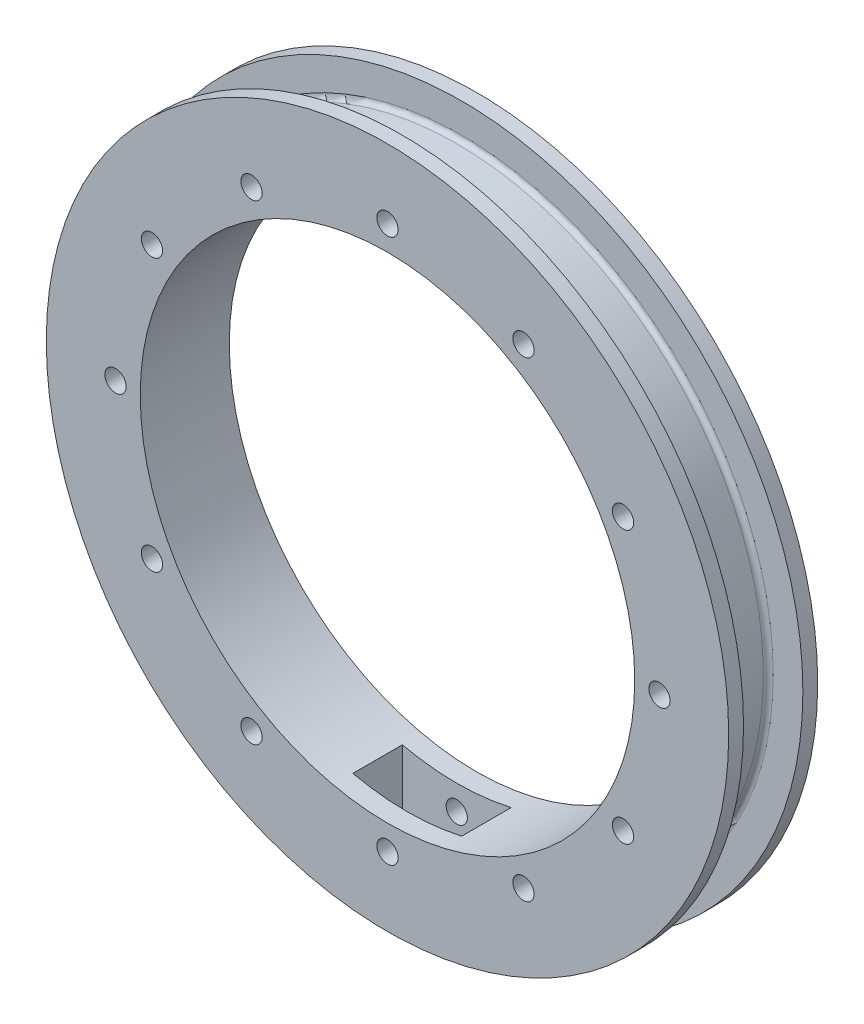
ISO-10303-21;
HEADER;
FILE_DESCRIPTION(('STEP AP214'),'2;1');
FILE_NAME('part.step','',(''),(''),'','','');
FILE_SCHEMA(('AUTOMOTIVE_DESIGN { 1 0 10303 214 1 1 1 1 }'));
ENDSEC;
DATA;
#1=APPLICATION_CONTEXT('core data for automotive mechanical design processes');
#2=APPLICATION_PROTOCOL_DEFINITION('international standard','automotive_design',2000,#1);
#3=PRODUCT_CONTEXT('',#1,'mechanical');
#4=PRODUCT('Part','Part','',(#3));
#5=PRODUCT_RELATED_PRODUCT_CATEGORY('part','',(#4));
#6=PRODUCT_DEFINITION_FORMATION('','',#4);
#7=PRODUCT_DEFINITION_CONTEXT('part definition',#1,'design');
#8=PRODUCT_DEFINITION('design','',#6,#7);
#9=PRODUCT_DEFINITION_SHAPE('','',#8);
#10=(LENGTH_UNIT() NAMED_UNIT(*) SI_UNIT(.MILLI.,.METRE.));
#11=(NAMED_UNIT(*) PLANE_ANGLE_UNIT() SI_UNIT($,.RADIAN.));
#12=(NAMED_UNIT(*) SI_UNIT($,.STERADIAN.) SOLID_ANGLE_UNIT());
#13=UNCERTAINTY_MEASURE_WITH_UNIT(LENGTH_MEASURE(1.E-05),#10,'distance_accuracy_value','');
#14=(GEOMETRIC_REPRESENTATION_CONTEXT(3) GLOBAL_UNCERTAINTY_ASSIGNED_CONTEXT((#13)) GLOBAL_UNIT_ASSIGNED_CONTEXT((#10,
#11,#12)) REPRESENTATION_CONTEXT('',''));
#15=CARTESIAN_POINT('',(0.,0.,0.));
#16=DIRECTION('',(0.,0.,1.));
#17=DIRECTION('',(1.,0.,0.));
#18=AXIS2_PLACEMENT_3D('',#15,#16,#17);
#19=CARTESIAN_POINT('',(0.,0.,-6.));
#20=DIRECTION('',(0.,0.,-1.));
#21=DIRECTION('',(-1.,0.,0.));
#22=AXIS2_PLACEMENT_3D('',#19,#20,#21);
#23=PLANE('',#22);
#24=CARTESIAN_POINT('',(0.,0.,-6.));
#25=DIRECTION('',(0.,0.,1.));
#26=DIRECTION('',(1.,0.,0.));
#27=AXIS2_PLACEMENT_3D('',#24,#25,#26);
#28=CIRCLE('',#27,69.);
#29=CARTESIAN_POINT('',(69.,0.,-6.));
#30=VERTEX_POINT('',#29);
#31=EDGE_CURVE('E129',#30,#30,#28,.F.);
#32=ORIENTED_EDGE('',*,*,#31,.F.);
#33=EDGE_LOOP('',(#32));
#34=FACE_BOUND('',#33,.T.);
#35=CARTESIAN_POINT('',(0.,0.,-6.));
#36=DIRECTION('',(0.,0.,1.));
#37=DIRECTION('',(-1.,0.,0.));
#38=AXIS2_PLACEMENT_3D('',#35,#36,#37);
#39=CIRCLE('',#38,63.);
#40=CARTESIAN_POINT('',(63.,0.,-6.));
#41=VERTEX_POINT('',#40);
#42=CARTESIAN_POINT('',(-63.,0.,-6.));
#43=VERTEX_POINT('',#42);
#44=EDGE_CURVE('E82',#41,#43,#39,.F.);
#45=ORIENTED_EDGE('',*,*,#44,.T.);
#46=CARTESIAN_POINT('',(0.,0.,-6.));
#47=DIRECTION('',(0.,0.,1.));
#48=DIRECTION('',(1.,0.,0.));
#49=AXIS2_PLACEMENT_3D('',#46,#47,#48);
#50=CIRCLE('',#49,63.);
#51=EDGE_CURVE('E79',#41,#43,#50,.T.);
#52=ORIENTED_EDGE('',*,*,#51,.F.);
#53=EDGE_LOOP('',(#45,#52));
#54=FACE_BOUND('',#53,.T.);
#55=ADVANCED_FACE('F17',(#34,#54),#23,.F.);
#56=CARTESIAN_POINT('',(0.,0.,-5.));
#57=DIRECTION('',(0.,0.,-1.));
#58=DIRECTION('',(-1.,0.,0.));
#59=AXIS2_PLACEMENT_3D('',#56,#57,#58);
#60=TOROIDAL_SURFACE('',#59,63.,1.);
#61=ORIENTED_EDGE('',*,*,#51,.T.);
#62=ORIENTED_EDGE('',*,*,#44,.F.);
#63=EDGE_LOOP('',(#61,#62));
#64=FACE_BOUND('',#63,.T.);
#65=CARTESIAN_POINT('',(0.,0.,-5.));
#66=DIRECTION('',(0.,0.,-1.));
#67=DIRECTION('',(-1.,0.,0.));
#68=AXIS2_PLACEMENT_3D('',#65,#66,#67);
#69=CIRCLE('',#68,62.);
#70=CARTESIAN_POINT('',(11.,-61.0163912403872,-5.));
#71=VERTEX_POINT('',#70);
#72=CARTESIAN_POINT('',(-11.,-61.0163912403872,-5.));
#73=VERTEX_POINT('',#72);
#74=EDGE_CURVE('E134',#71,#73,#69,.T.);
#75=ORIENTED_EDGE('',*,*,#74,.T.);
#76=CARTESIAN_POINT('',(0.,0.,-5.));
#77=DIRECTION('',(0.,0.,-1.));
#78=DIRECTION('',(-1.,0.,0.));
#79=AXIS2_PLACEMENT_3D('',#76,#77,#78);
#80=CIRCLE('',#79,62.);
#81=EDGE_CURVE('E61',#71,#73,#80,.F.);
#82=ORIENTED_EDGE('',*,*,#81,.F.);
#83=EDGE_LOOP('',(#75,#82));
#84=FACE_BOUND('',#83,.T.);
#85=ADVANCED_FACE('F81',(#64,#84),#60,.F.);
#86=CARTESIAN_POINT('',(0.,0.,6.));
#87=DIRECTION('',(0.,0.,-1.));
#88=DIRECTION('',(-1.,0.,0.));
#89=AXIS2_PLACEMENT_3D('',#86,#87,#88);
#90=CYLINDRICAL_SURFACE('',#89,62.);
#91=DIRECTION('',(0.,0.,-1.));
#92=VECTOR('',#91,1.);
#93=CARTESIAN_POINT('',(11.,-61.0163912403872,5.));
#94=LINE('',#93,#92);
#95=CARTESIAN_POINT('',(11.,-61.0163912403872,5.));
#96=VERTEX_POINT('',#95);
#97=EDGE_CURVE('E170',#96,#71,#94,.T.);
#98=ORIENTED_EDGE('',*,*,#97,.T.);
#99=ORIENTED_EDGE('',*,*,#81,.T.);
#100=DIRECTION('',(0.,0.,1.));
#101=VECTOR('',#100,1.);
#102=CARTESIAN_POINT('',(-11.,-61.0163912403872,5.));
#103=LINE('',#102,#101);
#104=CARTESIAN_POINT('',(-11.,-61.0163912403872,5.));
#105=VERTEX_POINT('',#104);
#106=EDGE_CURVE('E125',#73,#105,#103,.T.);
#107=ORIENTED_EDGE('',*,*,#106,.T.);
#108=CARTESIAN_POINT('',(0.,0.,5.));
#109=DIRECTION('',(0.,0.,1.));
#110=DIRECTION('',(1.,0.,0.));
#111=AXIS2_PLACEMENT_3D('',#108,#109,#110);
#112=CIRCLE('',#111,62.);
#113=EDGE_CURVE('E127',#105,#96,#112,.F.);
#114=ORIENTED_EDGE('',*,*,#113,.T.);
#115=EDGE_LOOP('',(#98,#99,#107,#114));
#116=FACE_BOUND('',#115,.T.);
#117=ADVANCED_FACE('F120',(#116),#90,.T.);
#118=CARTESIAN_POINT('',(-4.66937538383073E-12,-55.,124.));
#119=DIRECTION('',(0.,0.,-1.));
#120=DIRECTION('',(-1.,0.,0.));
#121=AXIS2_PLACEMENT_3D('',#118,#119,#120);
#122=CYLINDRICAL_SURFACE('',#121,2.15000000000483);
#123=CARTESIAN_POINT('',(-4.66937538383073E-12,-55.,-9.00000000000001));
#124=DIRECTION('',(0.,0.,-1.));
#125=DIRECTION('',(-1.,0.,0.));
#126=AXIS2_PLACEMENT_3D('',#123,#124,#125);
#127=CIRCLE('',#126,2.15000000000483);
#128=CARTESIAN_POINT('',(-2.1500000000095,-55.,-9.00000000000001));
#129=VERTEX_POINT('',#128);
#130=EDGE_CURVE('E199',#129,#129,#127,.F.);
#131=ORIENTED_EDGE('',*,*,#130,.F.);
#132=EDGE_LOOP('',(#131));
#133=FACE_BOUND('',#132,.T.);
#134=CARTESIAN_POINT('',(-4.66937538383073E-12,-55.,-5.));
#135=DIRECTION('',(0.,0.,-1.));
#136=DIRECTION('',(-1.,0.,0.));
#137=AXIS2_PLACEMENT_3D('',#134,#135,#136);
#138=CIRCLE('',#137,2.15000000000483);
#139=CARTESIAN_POINT('',(-2.1500000000095,-55.,-5.));
#140=VERTEX_POINT('',#139);
#141=EDGE_CURVE('E128',#140,#140,#138,.F.);
#142=ORIENTED_EDGE('',*,*,#141,.T.);
#143=EDGE_LOOP('',(#142));
#144=FACE_BOUND('',#143,.T.);
#145=ADVANCED_FACE('F414',(#133,#144),#122,.F.);
#146=CARTESIAN_POINT('',(0.,0.,-9.));
#147=DIRECTION('',(0.,0.,1.));
#148=DIRECTION('',(1.,0.,0.));
#149=AXIS2_PLACEMENT_3D('',#146,#147,#148);
#150=CYLINDRICAL_SURFACE('',#149,69.);
#151=ORIENTED_EDGE('',*,*,#31,.T.);
#152=EDGE_LOOP('',(#151));
#153=FACE_BOUND('',#152,.T.);
#154=CARTESIAN_POINT('',(0.,0.,-9.));
#155=DIRECTION('',(0.,0.,1.));
#156=DIRECTION('',(1.,0.,0.));
#157=AXIS2_PLACEMENT_3D('',#154,#155,#156);
#158=CIRCLE('',#157,69.);
#159=CARTESIAN_POINT('',(69.,0.,-9.));
#160=VERTEX_POINT('',#159);
#161=EDGE_CURVE('E209',#160,#160,#158,.F.);
#162=ORIENTED_EDGE('',*,*,#161,.F.);
#163=EDGE_LOOP('',(#162));
#164=FACE_BOUND('',#163,.T.);
#165=ADVANCED_FACE('F159',(#153,#164),#150,.T.);
#166=CARTESIAN_POINT('',(0.,0.,5.));
#167=DIRECTION('',(0.,0.,1.));
#168=DIRECTION('',(1.,0.,0.));
#169=AXIS2_PLACEMENT_3D('',#166,#167,#168);
#170=TOROIDAL_SURFACE('',#169,63.,1.);
#171=CARTESIAN_POINT('',(0.,0.,6.));
#172=DIRECTION('',(0.,0.,-1.));
#173=DIRECTION('',(-1.,0.,0.));
#174=AXIS2_PLACEMENT_3D('',#171,#172,#173);
#175=CIRCLE('',#174,63.);
#176=CARTESIAN_POINT('',(-63.,0.,6.));
#177=VERTEX_POINT('',#176);
#178=CARTESIAN_POINT('',(63.,0.,6.));
#179=VERTEX_POINT('',#178);
#180=EDGE_CURVE('E68',#177,#179,#175,.T.);
#181=ORIENTED_EDGE('',*,*,#180,.T.);
#182=CARTESIAN_POINT('',(0.,0.,6.));
#183=DIRECTION('',(0.,0.,-1.));
#184=DIRECTION('',(1.,0.,0.));
#185=AXIS2_PLACEMENT_3D('',#182,#183,#184);
#186=CIRCLE('',#185,63.);
#187=EDGE_CURVE('E143',#179,#177,#186,.T.);
#188=ORIENTED_EDGE('',*,*,#187,.T.);
#189=EDGE_LOOP('',(#181,#188));
#190=FACE_BOUND('',#189,.T.);
#191=CARTESIAN_POINT('',(0.,0.,5.));
#192=DIRECTION('',(0.,0.,1.));
#193=DIRECTION('',(1.,0.,0.));
#194=AXIS2_PLACEMENT_3D('',#191,#192,#193);
#195=CIRCLE('',#194,62.);
#196=EDGE_CURVE('E182',#105,#96,#195,.T.);
#197=ORIENTED_EDGE('',*,*,#196,.T.);
#198=ORIENTED_EDGE('',*,*,#113,.F.);
#199=EDGE_LOOP('',(#197,#198));
#200=FACE_BOUND('',#199,.T.);
#201=ADVANCED_FACE('F147',(#190,#200),#170,.F.);
#202=CARTESIAN_POINT('',(11.,-133.,-5.));
#203=DIRECTION('',(0.,0.,-1.));
#204=DIRECTION('',(-1.,0.,0.));
#205=AXIS2_PLACEMENT_3D('',#202,#203,#204);
#206=PLANE('',#205);
#207=CARTESIAN_POINT('',(0.,0.,-5.));
#208=DIRECTION('',(0.,0.,-1.));
#209=DIRECTION('',(-1.,0.,0.));
#210=AXIS2_PLACEMENT_3D('',#207,#208,#209);
#211=CIRCLE('',#210,50.);
#212=CARTESIAN_POINT('',(11.,-48.7749935930289,-5.));
#213=VERTEX_POINT('',#212);
#214=CARTESIAN_POINT('',(-11.,-48.7749935930289,-5.));
#215=VERTEX_POINT('',#214);
#216=EDGE_CURVE('E197',#213,#215,#211,.T.);
#217=ORIENTED_EDGE('',*,*,#216,.T.);
#218=DIRECTION('',(0.,1.,0.));
#219=VECTOR('',#218,1.);
#220=CARTESIAN_POINT('',(-11.,-133.,-5.));
#221=LINE('',#220,#219);
#222=EDGE_CURVE('E187',#215,#73,#221,.F.);
#223=ORIENTED_EDGE('',*,*,#222,.T.);
#224=ORIENTED_EDGE('',*,*,#74,.F.);
#225=DIRECTION('',(0.,1.,0.));
#226=VECTOR('',#225,1.);
#227=CARTESIAN_POINT('',(11.,-133.,-5.));
#228=LINE('',#227,#226);
#229=EDGE_CURVE('E165',#71,#213,#228,.T.);
#230=ORIENTED_EDGE('',*,*,#229,.T.);
#231=EDGE_LOOP('',(#217,#223,#224,#230));
#232=FACE_BOUND('',#231,.T.);
#233=ORIENTED_EDGE('',*,*,#141,.F.);
#234=EDGE_LOOP('',(#233));
#235=FACE_BOUND('',#234,.T.);
#236=ADVANCED_FACE('F158',(#232,#235),#206,.F.);
#237=CARTESIAN_POINT('',(-11.,-133.,5.));
#238=DIRECTION('',(-1.,0.,0.));
#239=DIRECTION('',(0.,0.,1.));
#240=AXIS2_PLACEMENT_3D('',#237,#238,#239);
#241=PLANE('',#240);
#242=DIRECTION('',(0.,0.,-1.));
#243=VECTOR('',#242,1.);
#244=CARTESIAN_POINT('',(-11.,-48.7749935930289,124.));
#245=LINE('',#244,#243);
#246=CARTESIAN_POINT('',(-11.,-48.7749935930289,5.));
#247=VERTEX_POINT('',#246);
#248=EDGE_CURVE('E195',#215,#247,#245,.F.);
#249=ORIENTED_EDGE('',*,*,#248,.T.);
#250=DIRECTION('',(0.,1.,0.));
#251=VECTOR('',#250,1.);
#252=CARTESIAN_POINT('',(-11.,-133.,5.));
#253=LINE('',#252,#251);
#254=EDGE_CURVE('E176',#247,#105,#253,.F.);
#255=ORIENTED_EDGE('',*,*,#254,.T.);
#256=ORIENTED_EDGE('',*,*,#106,.F.);
#257=ORIENTED_EDGE('',*,*,#222,.F.);
#258=EDGE_LOOP('',(#249,#255,#256,#257));
#259=FACE_BOUND('',#258,.T.);
#260=ADVANCED_FACE('F314',(#259),#241,.F.);
#261=CARTESIAN_POINT('',(11.,-133.,5.));
#262=DIRECTION('',(0.,0.,1.));
#263=DIRECTION('',(1.,0.,0.));
#264=AXIS2_PLACEMENT_3D('',#261,#262,#263);
#265=PLANE('',#264);
#266=CARTESIAN_POINT('',(0.,0.,5.));
#267=DIRECTION('',(0.,0.,-1.));
#268=DIRECTION('',(-1.,0.,0.));
#269=AXIS2_PLACEMENT_3D('',#266,#267,#268);
#270=CIRCLE('',#269,50.);
#271=CARTESIAN_POINT('',(11.,-48.7749935930289,5.));
#272=VERTEX_POINT('',#271);
#273=EDGE_CURVE('E37',#247,#272,#270,.F.);
#274=ORIENTED_EDGE('',*,*,#273,.T.);
#275=DIRECTION('',(0.,1.,0.));
#276=VECTOR('',#275,1.);
#277=CARTESIAN_POINT('',(11.,-133.,5.));
#278=LINE('',#277,#276);
#279=EDGE_CURVE('E180',#272,#96,#278,.F.);
#280=ORIENTED_EDGE('',*,*,#279,.T.);
#281=ORIENTED_EDGE('',*,*,#196,.F.);
#282=ORIENTED_EDGE('',*,*,#254,.F.);
#283=EDGE_LOOP('',(#274,#280,#281,#282));
#284=FACE_BOUND('',#283,.T.);
#285=CARTESIAN_POINT('',(-4.66937538383073E-12,-55.,5.));
#286=DIRECTION('',(0.,0.,-1.));
#287=DIRECTION('',(-1.,0.,0.));
#288=AXIS2_PLACEMENT_3D('',#285,#286,#287);
#289=CIRCLE('',#288,2.15000000000483);
#290=CARTESIAN_POINT('',(-2.1500000000095,-55.,5.));
#291=VERTEX_POINT('',#290);
#292=EDGE_CURVE('E239',#291,#291,#289,.F.);
#293=ORIENTED_EDGE('',*,*,#292,.T.);
#294=EDGE_LOOP('',(#293));
#295=FACE_BOUND('',#294,.T.);
#296=ADVANCED_FACE('F310',(#284,#295),#265,.F.);
#297=CARTESIAN_POINT('',(11.,-133.,5.));
#298=DIRECTION('',(1.,0.,0.));
#299=DIRECTION('',(0.,0.,-1.));
#300=AXIS2_PLACEMENT_3D('',#297,#298,#299);
#301=PLANE('',#300);
#302=DIRECTION('',(0.,0.,-1.));
#303=VECTOR('',#302,1.);
#304=CARTESIAN_POINT('',(11.,-48.7749935930289,124.));
#305=LINE('',#304,#303);
#306=EDGE_CURVE('E200',#272,#213,#305,.T.);
#307=ORIENTED_EDGE('',*,*,#306,.T.);
#308=ORIENTED_EDGE('',*,*,#229,.F.);
#309=ORIENTED_EDGE('',*,*,#97,.F.);
#310=ORIENTED_EDGE('',*,*,#279,.F.);
#311=EDGE_LOOP('',(#307,#308,#309,#310));
#312=FACE_BOUND('',#311,.T.);
#313=ADVANCED_FACE('F309',(#312),#301,.F.);
#314=CARTESIAN_POINT('',(0.,0.,-9.));
#315=DIRECTION('',(0.,0.,-1.));
#316=DIRECTION('',(-1.,0.,0.));
#317=AXIS2_PLACEMENT_3D('',#314,#315,#316);
#318=PLANE('',#317);
#319=ORIENTED_EDGE('',*,*,#161,.T.);
#320=EDGE_LOOP('',(#319));
#321=FACE_BOUND('',#320,.T.);
#322=CARTESIAN_POINT('',(0.,0.,-9.00000000000001));
#323=DIRECTION('',(0.,0.,-1.));
#324=DIRECTION('',(-1.,0.,0.));
#325=AXIS2_PLACEMENT_3D('',#322,#323,#324);
#326=CIRCLE('',#325,50.);
#327=CARTESIAN_POINT('',(-50.,0.,-9.00000000000001));
#328=VERTEX_POINT('',#327);
#329=EDGE_CURVE('E202',#328,#328,#326,.F.);
#330=ORIENTED_EDGE('',*,*,#329,.T.);
#331=EDGE_LOOP('',(#330));
#332=FACE_BOUND('',#331,.T.);
#333=CARTESIAN_POINT('',(47.6313972081406,-27.500000000002,-9.00000000000001));
#334=DIRECTION('',(0.,0.,-1.));
#335=DIRECTION('',(-1.,0.,0.));
#336=AXIS2_PLACEMENT_3D('',#333,#334,#335);
#337=CIRCLE('',#336,2.15000000000445);
#338=CARTESIAN_POINT('',(45.4813972081362,-27.500000000002,-9.00000000000001));
#339=VERTEX_POINT('',#338);
#340=EDGE_CURVE('E245',#339,#339,#337,.F.);
#341=ORIENTED_EDGE('',*,*,#340,.T.);
#342=EDGE_LOOP('',(#341));
#343=FACE_BOUND('',#342,.T.);
#344=CARTESIAN_POINT('',(27.4999999999956,-47.6313972081453,-9.00000000000001));
#345=DIRECTION('',(0.,0.,-1.));
#346=DIRECTION('',(-1.,0.,0.));
#347=AXIS2_PLACEMENT_3D('',#344,#345,#346);
#348=CIRCLE('',#347,2.15000000000495);
#349=CARTESIAN_POINT('',(25.3499999999907,-47.6313972081453,-9.00000000000001));
#350=VERTEX_POINT('',#349);
#351=EDGE_CURVE('E242',#350,#350,#348,.F.);
#352=ORIENTED_EDGE('',*,*,#351,.T.);
#353=EDGE_LOOP('',(#352));
#354=FACE_BOUND('',#353,.T.);
#355=ORIENTED_EDGE('',*,*,#130,.T.);
#356=EDGE_LOOP('',(#355));
#357=FACE_BOUND('',#356,.T.);
#358=CARTESIAN_POINT('',(-27.5000000000044,-47.6313972081429,-9.00000000000001));
#359=DIRECTION('',(0.,0.,-1.));
#360=DIRECTION('',(-1.,0.,0.));
#361=AXIS2_PLACEMENT_3D('',#358,#359,#360);
#362=CIRCLE('',#361,2.15000000000414);
#363=CARTESIAN_POINT('',(-29.6500000000085,-47.6313972081429,-9.00000000000001));
#364=VERTEX_POINT('',#363);
#365=EDGE_CURVE('E236',#364,#364,#362,.F.);
#366=ORIENTED_EDGE('',*,*,#365,.T.);
#367=EDGE_LOOP('',(#366));
#368=FACE_BOUND('',#367,.T.);
#369=CARTESIAN_POINT('',(-47.6313972081476,-27.499999999998,-9.00000000000001));
#370=DIRECTION('',(0.,0.,-1.));
#371=DIRECTION('',(-1.,0.,0.));
#372=AXIS2_PLACEMENT_3D('',#369,#370,#371);
#373=CIRCLE('',#372,2.15000000000301);
#374=CARTESIAN_POINT('',(-49.7813972081506,-27.499999999998,-9.00000000000001));
#375=VERTEX_POINT('',#374);
#376=EDGE_CURVE('E233',#375,#375,#373,.F.);
#377=ORIENTED_EDGE('',*,*,#376,.T.);
#378=EDGE_LOOP('',(#377));
#379=FACE_BOUND('',#378,.T.);
#380=CARTESIAN_POINT('',(-55.0000000000023,2.33468769191537E-12,-9.00000000000001));
#381=DIRECTION('',(0.,0.,-1.));
#382=DIRECTION('',(-1.,0.,0.));
#383=AXIS2_PLACEMENT_3D('',#380,#381,#382);
#384=CIRCLE('',#383,2.15000000000173);
#385=CARTESIAN_POINT('',(-57.1500000000041,2.33468769191537E-12,-9.00000000000001));
#386=VERTEX_POINT('',#385);
#387=EDGE_CURVE('E230',#386,#386,#384,.F.);
#388=ORIENTED_EDGE('',*,*,#387,.T.);
#389=EDGE_LOOP('',(#388));
#390=FACE_BOUND('',#389,.T.);
#391=CARTESIAN_POINT('',(-47.6313972081453,27.500000000002,-9.00000000000001));
#392=DIRECTION('',(0.,0.,-1.));
#393=DIRECTION('',(-1.,0.,0.));
#394=AXIS2_PLACEMENT_3D('',#391,#392,#393);
#395=CIRCLE('',#394,2.15000000000064);
#396=CARTESIAN_POINT('',(-49.7813972081459,27.500000000002,-9.00000000000001));
#397=VERTEX_POINT('',#396);
#398=EDGE_CURVE('E227',#397,#397,#395,.F.);
#399=ORIENTED_EDGE('',*,*,#398,.T.);
#400=EDGE_LOOP('',(#399));
#401=FACE_BOUND('',#400,.T.);
#402=CARTESIAN_POINT('',(-27.5000000000001,47.6313972081441,-9.00000000000001));
#403=DIRECTION('',(0.,0.,-1.));
#404=DIRECTION('',(-1.,0.,0.));
#405=AXIS2_PLACEMENT_3D('',#402,#403,#404);
#406=CIRCLE('',#405,2.15);
#407=CARTESIAN_POINT('',(-29.6500000000001,47.6313972081441,-9.00000000000001));
#408=VERTEX_POINT('',#407);
#409=EDGE_CURVE('E224',#408,#408,#406,.F.);
#410=ORIENTED_EDGE('',*,*,#409,.T.);
#411=EDGE_LOOP('',(#410));
#412=FACE_BOUND('',#411,.T.);
#413=CARTESIAN_POINT('',(54.9999999999977,-2.34142324931068E-12,-9.00000000000001));
#414=DIRECTION('',(0.,0.,-1.));
#415=DIRECTION('',(-1.,0.,0.));
#416=AXIS2_PLACEMENT_3D('',#413,#414,#415);
#417=CIRCLE('',#416,2.15000000000347);
#418=CARTESIAN_POINT('',(52.8499999999942,-2.34142324931068E-12,-9.00000000000001));
#419=VERTEX_POINT('',#418);
#420=EDGE_CURVE('E221',#419,#419,#417,.F.);
#421=ORIENTED_EDGE('',*,*,#420,.T.);
#422=EDGE_LOOP('',(#421));
#423=FACE_BOUND('',#422,.T.);
#424=CARTESIAN_POINT('',(47.631397208143,27.4999999999979,-9.00000000000001));
#425=DIRECTION('',(0.,0.,-1.));
#426=DIRECTION('',(-1.,0.,0.));
#427=AXIS2_PLACEMENT_3D('',#424,#425,#426);
#428=CIRCLE('',#427,2.15000000000237);
#429=CARTESIAN_POINT('',(45.4813972081406,27.4999999999979,-9.00000000000001));
#430=VERTEX_POINT('',#429);
#431=EDGE_CURVE('E218',#430,#430,#428,.F.);
#432=ORIENTED_EDGE('',*,*,#431,.T.);
#433=EDGE_LOOP('',(#432));
#434=FACE_BOUND('',#433,.T.);
#435=CARTESIAN_POINT('',(27.4999999999997,47.6313972081429,-9.00000000000001));
#436=DIRECTION('',(0.,0.,-1.));
#437=DIRECTION('',(-1.,0.,0.));
#438=AXIS2_PLACEMENT_3D('',#435,#436,#437);
#439=CIRCLE('',#438,2.15000000000135);
#440=CARTESIAN_POINT('',(25.3499999999984,47.6313972081429,-9.00000000000001));
#441=VERTEX_POINT('',#440);
#442=EDGE_CURVE('E215',#441,#441,#439,.F.);
#443=ORIENTED_EDGE('',*,*,#442,.T.);
#444=EDGE_LOOP('',(#443));
#445=FACE_BOUND('',#444,.T.);
#446=CARTESIAN_POINT('',(0.,55.,-9.00000000000001));
#447=DIRECTION('',(0.,0.,-1.));
#448=DIRECTION('',(-1.,0.,0.));
#449=AXIS2_PLACEMENT_3D('',#446,#447,#448);
#450=CIRCLE('',#449,2.15);
#451=CARTESIAN_POINT('',(-2.15,55.,-9.00000000000001));
#452=VERTEX_POINT('',#451);
#453=EDGE_CURVE('E212',#452,#452,#450,.F.);
#454=ORIENTED_EDGE('',*,*,#453,.T.);
#455=EDGE_LOOP('',(#454));
#456=FACE_BOUND('',#455,.T.);
#457=ADVANCED_FACE('F352',(#321,#332,#343,#354,#357,#368,#379,#390,#401,#412,#423,#434,#445,
#456),#318,.T.);
#458=CARTESIAN_POINT('',(0.,0.,6.));
#459=DIRECTION('',(0.,0.,1.));
#460=DIRECTION('',(1.,0.,0.));
#461=AXIS2_PLACEMENT_3D('',#458,#459,#460);
#462=PLANE('',#461);
#463=CARTESIAN_POINT('',(0.,0.,6.));
#464=DIRECTION('',(0.,0.,-1.));
#465=DIRECTION('',(-1.,0.,0.));
#466=AXIS2_PLACEMENT_3D('',#463,#464,#465);
#467=CIRCLE('',#466,69.);
#468=CARTESIAN_POINT('',(-69.,0.,6.));
#469=VERTEX_POINT('',#468);
#470=EDGE_CURVE('E252',#469,#469,#467,.F.);
#471=ORIENTED_EDGE('',*,*,#470,.F.);
#472=EDGE_LOOP('',(#471));
#473=FACE_BOUND('',#472,.T.);
#474=ORIENTED_EDGE('',*,*,#187,.F.);
#475=ORIENTED_EDGE('',*,*,#180,.F.);
#476=EDGE_LOOP('',(#474,#475));
#477=FACE_BOUND('',#476,.T.);
#478=ADVANCED_FACE('F355',(#473,#477),#462,.F.);
#479=CARTESIAN_POINT('',(0.,55.,124.));
#480=DIRECTION('',(0.,0.,-1.));
#481=DIRECTION('',(-1.,0.,0.));
#482=AXIS2_PLACEMENT_3D('',#479,#480,#481);
#483=CYLINDRICAL_SURFACE('',#482,2.15);
#484=CARTESIAN_POINT('',(0.,55.,9.00000000000001));
#485=DIRECTION('',(0.,0.,-1.));
#486=DIRECTION('',(-1.,0.,0.));
#487=AXIS2_PLACEMENT_3D('',#484,#485,#486);
#488=CIRCLE('',#487,2.15);
#489=CARTESIAN_POINT('',(-2.15,55.,9.00000000000001));
#490=VERTEX_POINT('',#489);
#491=EDGE_CURVE('E255',#490,#490,#488,.T.);
#492=ORIENTED_EDGE('',*,*,#491,.F.);
#493=EDGE_LOOP('',(#492));
#494=FACE_BOUND('',#493,.T.);
#495=ORIENTED_EDGE('',*,*,#453,.F.);
#496=EDGE_LOOP('',(#495));
#497=FACE_BOUND('',#496,.T.);
#498=ADVANCED_FACE('F380',(#494,#497),#483,.F.);
#499=CARTESIAN_POINT('',(27.4999999999997,47.6313972081429,124.));
#500=DIRECTION('',(0.,0.,-1.));
#501=DIRECTION('',(-1.,0.,0.));
#502=AXIS2_PLACEMENT_3D('',#499,#500,#501);
#503=CYLINDRICAL_SURFACE('',#502,2.15000000000135);
#504=CARTESIAN_POINT('',(27.4999999999997,47.6313972081429,9.00000000000001));
#505=DIRECTION('',(0.,0.,-1.));
#506=DIRECTION('',(-1.,0.,0.));
#507=AXIS2_PLACEMENT_3D('',#504,#505,#506);
#508=CIRCLE('',#507,2.15000000000135);
#509=CARTESIAN_POINT('',(25.3499999999984,47.6313972081429,9.00000000000001));
#510=VERTEX_POINT('',#509);
#511=EDGE_CURVE('E258',#510,#510,#508,.T.);
#512=ORIENTED_EDGE('',*,*,#511,.F.);
#513=EDGE_LOOP('',(#512));
#514=FACE_BOUND('',#513,.T.);
#515=ORIENTED_EDGE('',*,*,#442,.F.);
#516=EDGE_LOOP('',(#515));
#517=FACE_BOUND('',#516,.T.);
#518=ADVANCED_FACE('F382',(#514,#517),#503,.F.);
#519=CARTESIAN_POINT('',(47.631397208143,27.4999999999979,124.));
#520=DIRECTION('',(0.,0.,-1.));
#521=DIRECTION('',(-1.,0.,0.));
#522=AXIS2_PLACEMENT_3D('',#519,#520,#521);
#523=CYLINDRICAL_SURFACE('',#522,2.15000000000237);
#524=CARTESIAN_POINT('',(47.631397208143,27.4999999999979,9.00000000000001));
#525=DIRECTION('',(0.,0.,-1.));
#526=DIRECTION('',(-1.,0.,0.));
#527=AXIS2_PLACEMENT_3D('',#524,#525,#526);
#528=CIRCLE('',#527,2.15000000000237);
#529=CARTESIAN_POINT('',(45.4813972081406,27.4999999999979,9.00000000000001));
#530=VERTEX_POINT('',#529);
#531=EDGE_CURVE('E261',#530,#530,#528,.T.);
#532=ORIENTED_EDGE('',*,*,#531,.F.);
#533=EDGE_LOOP('',(#532));
#534=FACE_BOUND('',#533,.T.);
#535=ORIENTED_EDGE('',*,*,#431,.F.);
#536=EDGE_LOOP('',(#535));
#537=FACE_BOUND('',#536,.T.);
#538=ADVANCED_FACE('F389',(#534,#537),#523,.F.);
#539=CARTESIAN_POINT('',(54.9999999999977,-2.34142324931068E-12,124.));
#540=DIRECTION('',(0.,0.,-1.));
#541=DIRECTION('',(-1.,0.,0.));
#542=AXIS2_PLACEMENT_3D('',#539,#540,#541);
#543=CYLINDRICAL_SURFACE('',#542,2.15000000000347);
#544=CARTESIAN_POINT('',(54.9999999999977,-2.34142324931068E-12,9.00000000000001));
#545=DIRECTION('',(0.,0.,-1.));
#546=DIRECTION('',(-1.,0.,0.));
#547=AXIS2_PLACEMENT_3D('',#544,#545,#546);
#548=CIRCLE('',#547,2.15000000000347);
#549=CARTESIAN_POINT('',(52.8499999999942,-2.34142324931068E-12,9.00000000000001));
#550=VERTEX_POINT('',#549);
#551=EDGE_CURVE('E264',#550,#550,#548,.T.);
#552=ORIENTED_EDGE('',*,*,#551,.F.);
#553=EDGE_LOOP('',(#552));
#554=FACE_BOUND('',#553,.T.);
#555=ORIENTED_EDGE('',*,*,#420,.F.);
#556=EDGE_LOOP('',(#555));
#557=FACE_BOUND('',#556,.T.);
#558=ADVANCED_FACE('F490',(#554,#557),#543,.F.);
#559=CARTESIAN_POINT('',(-27.5000000000001,47.6313972081441,124.));
#560=DIRECTION('',(0.,0.,-1.));
#561=DIRECTION('',(-1.,0.,0.));
#562=AXIS2_PLACEMENT_3D('',#559,#560,#561);
#563=CYLINDRICAL_SURFACE('',#562,2.15);
#564=CARTESIAN_POINT('',(-27.5000000000001,47.6313972081441,9.00000000000001));
#565=DIRECTION('',(0.,0.,-1.));
#566=DIRECTION('',(-1.,0.,0.));
#567=AXIS2_PLACEMENT_3D('',#564,#565,#566);
#568=CIRCLE('',#567,2.15);
#569=CARTESIAN_POINT('',(-29.6500000000001,47.6313972081441,9.00000000000001));
#570=VERTEX_POINT('',#569);
#571=EDGE_CURVE('E267',#570,#570,#568,.T.);
#572=ORIENTED_EDGE('',*,*,#571,.F.);
#573=EDGE_LOOP('',(#572));
#574=FACE_BOUND('',#573,.T.);
#575=ORIENTED_EDGE('',*,*,#409,.F.);
#576=EDGE_LOOP('',(#575));
#577=FACE_BOUND('',#576,.T.);
#578=ADVANCED_FACE('F499',(#574,#577),#563,.F.);
#579=CARTESIAN_POINT('',(-47.6313972081453,27.500000000002,124.));
#580=DIRECTION('',(0.,0.,-1.));
#581=DIRECTION('',(-1.,0.,0.));
#582=AXIS2_PLACEMENT_3D('',#579,#580,#581);
#583=CYLINDRICAL_SURFACE('',#582,2.15000000000064);
#584=CARTESIAN_POINT('',(-47.6313972081453,27.500000000002,9.00000000000001));
#585=DIRECTION('',(0.,0.,-1.));
#586=DIRECTION('',(-1.,0.,0.));
#587=AXIS2_PLACEMENT_3D('',#584,#585,#586);
#588=CIRCLE('',#587,2.15000000000064);
#589=CARTESIAN_POINT('',(-49.7813972081459,27.500000000002,9.00000000000001));
#590=VERTEX_POINT('',#589);
#591=EDGE_CURVE('E270',#590,#590,#588,.T.);
#592=ORIENTED_EDGE('',*,*,#591,.F.);
#593=EDGE_LOOP('',(#592));
#594=FACE_BOUND('',#593,.T.);
#595=ORIENTED_EDGE('',*,*,#398,.F.);
#596=EDGE_LOOP('',(#595));
#597=FACE_BOUND('',#596,.T.);
#598=ADVANCED_FACE('F509',(#594,#597),#583,.F.);
#599=CARTESIAN_POINT('',(-55.0000000000023,2.33468769191537E-12,124.));
#600=DIRECTION('',(0.,0.,-1.));
#601=DIRECTION('',(-1.,0.,0.));
#602=AXIS2_PLACEMENT_3D('',#599,#600,#601);
#603=CYLINDRICAL_SURFACE('',#602,2.15000000000173);
#604=CARTESIAN_POINT('',(-55.0000000000023,2.33468769191537E-12,9.00000000000001));
#605=DIRECTION('',(0.,0.,-1.));
#606=DIRECTION('',(-1.,0.,0.));
#607=AXIS2_PLACEMENT_3D('',#604,#605,#606);
#608=CIRCLE('',#607,2.15000000000173);
#609=CARTESIAN_POINT('',(-57.1500000000041,2.33468769191537E-12,9.00000000000001));
#610=VERTEX_POINT('',#609);
#611=EDGE_CURVE('E273',#610,#610,#608,.T.);
#612=ORIENTED_EDGE('',*,*,#611,.F.);
#613=EDGE_LOOP('',(#612));
#614=FACE_BOUND('',#613,.T.);
#615=ORIENTED_EDGE('',*,*,#387,.F.);
#616=EDGE_LOOP('',(#615));
#617=FACE_BOUND('',#616,.T.);
#618=ADVANCED_FACE('F519',(#614,#617),#603,.F.);
#619=CARTESIAN_POINT('',(-47.6313972081476,-27.499999999998,124.));
#620=DIRECTION('',(0.,0.,-1.));
#621=DIRECTION('',(-1.,0.,0.));
#622=AXIS2_PLACEMENT_3D('',#619,#620,#621);
#623=CYLINDRICAL_SURFACE('',#622,2.15000000000301);
#624=CARTESIAN_POINT('',(-47.6313972081476,-27.499999999998,9.00000000000001));
#625=DIRECTION('',(0.,0.,-1.));
#626=DIRECTION('',(-1.,0.,0.));
#627=AXIS2_PLACEMENT_3D('',#624,#625,#626);
#628=CIRCLE('',#627,2.15000000000301);
#629=CARTESIAN_POINT('',(-49.7813972081506,-27.499999999998,9.00000000000001));
#630=VERTEX_POINT('',#629);
#631=EDGE_CURVE('E276',#630,#630,#628,.T.);
#632=ORIENTED_EDGE('',*,*,#631,.F.);
#633=EDGE_LOOP('',(#632));
#634=FACE_BOUND('',#633,.T.);
#635=ORIENTED_EDGE('',*,*,#376,.F.);
#636=EDGE_LOOP('',(#635));
#637=FACE_BOUND('',#636,.T.);
#638=ADVANCED_FACE('F331',(#634,#637),#623,.F.);
#639=CARTESIAN_POINT('',(-27.5000000000044,-47.6313972081429,124.));
#640=DIRECTION('',(0.,0.,-1.));
#641=DIRECTION('',(-1.,0.,0.));
#642=AXIS2_PLACEMENT_3D('',#639,#640,#641);
#643=CYLINDRICAL_SURFACE('',#642,2.15000000000414);
#644=CARTESIAN_POINT('',(-27.5000000000044,-47.6313972081429,9.00000000000001));
#645=DIRECTION('',(0.,0.,-1.));
#646=DIRECTION('',(-1.,0.,0.));
#647=AXIS2_PLACEMENT_3D('',#644,#645,#646);
#648=CIRCLE('',#647,2.15000000000414);
#649=CARTESIAN_POINT('',(-29.6500000000085,-47.6313972081429,9.00000000000001));
#650=VERTEX_POINT('',#649);
#651=EDGE_CURVE('E279',#650,#650,#648,.T.);
#652=ORIENTED_EDGE('',*,*,#651,.F.);
#653=EDGE_LOOP('',(#652));
#654=FACE_BOUND('',#653,.T.);
#655=ORIENTED_EDGE('',*,*,#365,.F.);
#656=EDGE_LOOP('',(#655));
#657=FACE_BOUND('',#656,.T.);
#658=ADVANCED_FACE('F321',(#654,#657),#643,.F.);
#659=CARTESIAN_POINT('',(-4.66937538383073E-12,-55.,124.));
#660=DIRECTION('',(0.,0.,-1.));
#661=DIRECTION('',(-1.,0.,0.));
#662=AXIS2_PLACEMENT_3D('',#659,#660,#661);
#663=CYLINDRICAL_SURFACE('',#662,2.15000000000483);
#664=CARTESIAN_POINT('',(-4.66937538383073E-12,-55.,9.00000000000001));
#665=DIRECTION('',(0.,0.,-1.));
#666=DIRECTION('',(-1.,0.,0.));
#667=AXIS2_PLACEMENT_3D('',#664,#665,#666);
#668=CIRCLE('',#667,2.15000000000483);
#669=CARTESIAN_POINT('',(-2.1500000000095,-55.,9.00000000000001));
#670=VERTEX_POINT('',#669);
#671=EDGE_CURVE('E282',#670,#670,#668,.T.);
#672=ORIENTED_EDGE('',*,*,#671,.F.);
#673=EDGE_LOOP('',(#672));
#674=FACE_BOUND('',#673,.T.);
#675=ORIENTED_EDGE('',*,*,#292,.F.);
#676=EDGE_LOOP('',(#675));
#677=FACE_BOUND('',#676,.T.);
#678=ADVANCED_FACE('F318',(#674,#677),#663,.F.);
#679=CARTESIAN_POINT('',(27.4999999999956,-47.6313972081453,124.));
#680=DIRECTION('',(0.,0.,-1.));
#681=DIRECTION('',(-1.,0.,0.));
#682=AXIS2_PLACEMENT_3D('',#679,#680,#681);
#683=CYLINDRICAL_SURFACE('',#682,2.15000000000495);
#684=CARTESIAN_POINT('',(27.4999999999956,-47.6313972081453,9.00000000000001));
#685=DIRECTION('',(0.,0.,-1.));
#686=DIRECTION('',(-1.,0.,0.));
#687=AXIS2_PLACEMENT_3D('',#684,#685,#686);
#688=CIRCLE('',#687,2.15000000000495);
#689=CARTESIAN_POINT('',(25.3499999999907,-47.6313972081453,9.00000000000001));
#690=VERTEX_POINT('',#689);
#691=EDGE_CURVE('E285',#690,#690,#688,.T.);
#692=ORIENTED_EDGE('',*,*,#691,.F.);
#693=EDGE_LOOP('',(#692));
#694=FACE_BOUND('',#693,.T.);
#695=ORIENTED_EDGE('',*,*,#351,.F.);
#696=EDGE_LOOP('',(#695));
#697=FACE_BOUND('',#696,.T.);
#698=ADVANCED_FACE('F320',(#694,#697),#683,.F.);
#699=CARTESIAN_POINT('',(47.6313972081406,-27.500000000002,124.));
#700=DIRECTION('',(0.,0.,-1.));
#701=DIRECTION('',(-1.,0.,0.));
#702=AXIS2_PLACEMENT_3D('',#699,#700,#701);
#703=CYLINDRICAL_SURFACE('',#702,2.15000000000445);
#704=CARTESIAN_POINT('',(47.6313972081406,-27.500000000002,9.00000000000001));
#705=DIRECTION('',(0.,0.,-1.));
#706=DIRECTION('',(-1.,0.,0.));
#707=AXIS2_PLACEMENT_3D('',#704,#705,#706);
#708=CIRCLE('',#707,2.15000000000445);
#709=CARTESIAN_POINT('',(45.4813972081362,-27.500000000002,9.00000000000001));
#710=VERTEX_POINT('',#709);
#711=EDGE_CURVE('E288',#710,#710,#708,.T.);
#712=ORIENTED_EDGE('',*,*,#711,.F.);
#713=EDGE_LOOP('',(#712));
#714=FACE_BOUND('',#713,.T.);
#715=ORIENTED_EDGE('',*,*,#340,.F.);
#716=EDGE_LOOP('',(#715));
#717=FACE_BOUND('',#716,.T.);
#718=ADVANCED_FACE('F300',(#714,#717),#703,.F.);
#719=CARTESIAN_POINT('',(0.,0.,124.));
#720=DIRECTION('',(0.,0.,-1.));
#721=DIRECTION('',(-1.,0.,0.));
#722=AXIS2_PLACEMENT_3D('',#719,#720,#721);
#723=CYLINDRICAL_SURFACE('',#722,50.);
#724=CARTESIAN_POINT('',(0.,0.,9.00000000000001));
#725=DIRECTION('',(0.,0.,-1.));
#726=DIRECTION('',(-1.,0.,0.));
#727=AXIS2_PLACEMENT_3D('',#724,#725,#726);
#728=CIRCLE('',#727,50.);
#729=CARTESIAN_POINT('',(-50.,0.,9.00000000000001));
#730=VERTEX_POINT('',#729);
#731=EDGE_CURVE('E28',#730,#730,#728,.T.);
#732=ORIENTED_EDGE('',*,*,#731,.F.);
#733=EDGE_LOOP('',(#732));
#734=FACE_BOUND('',#733,.T.);
#735=ORIENTED_EDGE('',*,*,#329,.F.);
#736=EDGE_LOOP('',(#735));
#737=FACE_BOUND('',#736,.T.);
#738=ORIENTED_EDGE('',*,*,#273,.F.);
#739=ORIENTED_EDGE('',*,*,#248,.F.);
#740=ORIENTED_EDGE('',*,*,#216,.F.);
#741=ORIENTED_EDGE('',*,*,#306,.F.);
#742=EDGE_LOOP('',(#738,#739,#740,#741));
#743=FACE_BOUND('',#742,.T.);
#744=ADVANCED_FACE('F296',(#734,#737,#743),#723,.F.);
#745=CARTESIAN_POINT('',(0.,0.,9.));
#746=DIRECTION('',(0.,0.,-1.));
#747=DIRECTION('',(-1.,0.,0.));
#748=AXIS2_PLACEMENT_3D('',#745,#746,#747);
#749=CYLINDRICAL_SURFACE('',#748,69.);
#750=ORIENTED_EDGE('',*,*,#470,.T.);
#751=EDGE_LOOP('',(#750));
#752=FACE_BOUND('',#751,.T.);
#753=CARTESIAN_POINT('',(0.,0.,9.));
#754=DIRECTION('',(0.,0.,-1.));
#755=DIRECTION('',(-1.,0.,0.));
#756=AXIS2_PLACEMENT_3D('',#753,#754,#755);
#757=CIRCLE('',#756,69.);
#758=CARTESIAN_POINT('',(-69.,0.,9.));
#759=VERTEX_POINT('',#758);
#760=EDGE_CURVE('E11',#759,#759,#757,.F.);
#761=ORIENTED_EDGE('',*,*,#760,.F.);
#762=EDGE_LOOP('',(#761));
#763=FACE_BOUND('',#762,.T.);
#764=ADVANCED_FACE('F299',(#752,#763),#749,.T.);
#765=CARTESIAN_POINT('',(0.,0.,9.));
#766=DIRECTION('',(0.,0.,1.));
#767=DIRECTION('',(1.,0.,0.));
#768=AXIS2_PLACEMENT_3D('',#765,#766,#767);
#769=PLANE('',#768);
#770=ORIENTED_EDGE('',*,*,#760,.T.);
#771=EDGE_LOOP('',(#770));
#772=FACE_BOUND('',#771,.T.);
#773=ORIENTED_EDGE('',*,*,#731,.T.);
#774=EDGE_LOOP('',(#773));
#775=FACE_BOUND('',#774,.T.);
#776=ORIENTED_EDGE('',*,*,#711,.T.);
#777=EDGE_LOOP('',(#776));
#778=FACE_BOUND('',#777,.T.);
#779=ORIENTED_EDGE('',*,*,#691,.T.);
#780=EDGE_LOOP('',(#779));
#781=FACE_BOUND('',#780,.T.);
#782=ORIENTED_EDGE('',*,*,#671,.T.);
#783=EDGE_LOOP('',(#782));
#784=FACE_BOUND('',#783,.T.);
#785=ORIENTED_EDGE('',*,*,#651,.T.);
#786=EDGE_LOOP('',(#785));
#787=FACE_BOUND('',#786,.T.);
#788=ORIENTED_EDGE('',*,*,#631,.T.);
#789=EDGE_LOOP('',(#788));
#790=FACE_BOUND('',#789,.T.);
#791=ORIENTED_EDGE('',*,*,#611,.T.);
#792=EDGE_LOOP('',(#791));
#793=FACE_BOUND('',#792,.T.);
#794=ORIENTED_EDGE('',*,*,#591,.T.);
#795=EDGE_LOOP('',(#794));
#796=FACE_BOUND('',#795,.T.);
#797=ORIENTED_EDGE('',*,*,#571,.T.);
#798=EDGE_LOOP('',(#797));
#799=FACE_BOUND('',#798,.T.);
#800=ORIENTED_EDGE('',*,*,#551,.T.);
#801=EDGE_LOOP('',(#800));
#802=FACE_BOUND('',#801,.T.);
#803=ORIENTED_EDGE('',*,*,#531,.T.);
#804=EDGE_LOOP('',(#803));
#805=FACE_BOUND('',#804,.T.);
#806=ORIENTED_EDGE('',*,*,#511,.T.);
#807=EDGE_LOOP('',(#806));
#808=FACE_BOUND('',#807,.T.);
#809=ORIENTED_EDGE('',*,*,#491,.T.);
#810=EDGE_LOOP('',(#809));
#811=FACE_BOUND('',#810,.T.);
#812=ADVANCED_FACE('F293',(#772,#775,#778,#781,#784,#787,#790,#793,#796,#799,#802,#805,#808,
#811),#769,.T.);
#813=CLOSED_SHELL('',(#55,#85,#117,#145,#165,#201,#236,#260,#296,#313,#457,#478,#498,#518,#538,
#558,#578,#598,#618,#638,#658,#678,#698,#718,#744,#764,#812));
#814=MANIFOLD_SOLID_BREP('B1',#813);
#815=ADVANCED_BREP_SHAPE_REPRESENTATION('',(#18,#814),#14);
#816=SHAPE_DEFINITION_REPRESENTATION(#9,#815);
ENDSEC;
END-ISO-10303-21;
